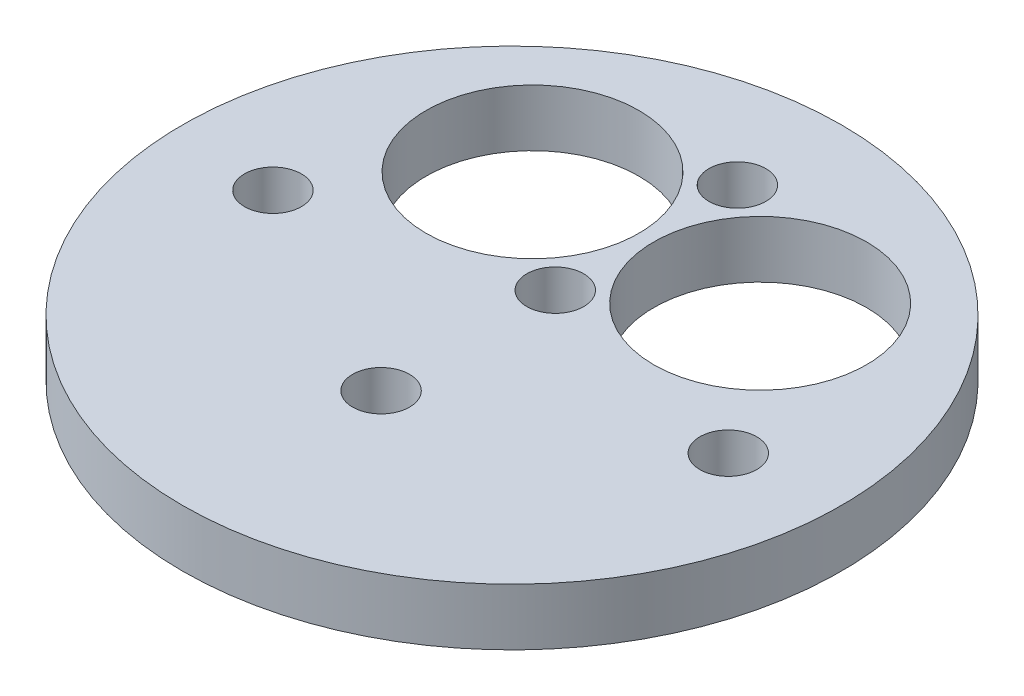
ISO-10303-21;
HEADER;
FILE_DESCRIPTION(('STEP AP214'),'2;1');
FILE_NAME('part.step','',(''),(''),'','','');
FILE_SCHEMA(('AUTOMOTIVE_DESIGN { 1 0 10303 214 1 1 1 1 }'));
ENDSEC;
DATA;
#1=APPLICATION_CONTEXT('core data for automotive mechanical design processes');
#2=APPLICATION_PROTOCOL_DEFINITION('international standard','automotive_design',2000,#1);
#3=PRODUCT_CONTEXT('',#1,'mechanical');
#4=PRODUCT('Part','Part','',(#3));
#5=PRODUCT_RELATED_PRODUCT_CATEGORY('part','',(#4));
#6=PRODUCT_DEFINITION_FORMATION('','',#4);
#7=PRODUCT_DEFINITION_CONTEXT('part definition',#1,'design');
#8=PRODUCT_DEFINITION('design','',#6,#7);
#9=PRODUCT_DEFINITION_SHAPE('','',#8);
#10=(LENGTH_UNIT() NAMED_UNIT(*) SI_UNIT(.MILLI.,.METRE.));
#11=(NAMED_UNIT(*) PLANE_ANGLE_UNIT() SI_UNIT($,.RADIAN.));
#12=(NAMED_UNIT(*) SI_UNIT($,.STERADIAN.) SOLID_ANGLE_UNIT());
#13=UNCERTAINTY_MEASURE_WITH_UNIT(LENGTH_MEASURE(1.E-05),#10,'distance_accuracy_value','');
#14=(GEOMETRIC_REPRESENTATION_CONTEXT(3) GLOBAL_UNCERTAINTY_ASSIGNED_CONTEXT((#13)) GLOBAL_UNIT_ASSIGNED_CONTEXT((#10,
#11,#12)) REPRESENTATION_CONTEXT('',''));
#15=CARTESIAN_POINT('',(0.,0.,0.));
#16=DIRECTION('',(0.,0.,1.));
#17=DIRECTION('',(1.,0.,0.));
#18=AXIS2_PLACEMENT_3D('',#15,#16,#17);
#19=CARTESIAN_POINT('',(0.,0.,0.));
#20=DIRECTION('',(0.,-1.,0.));
#21=DIRECTION('',(0.,0.,-1.));
#22=AXIS2_PLACEMENT_3D('',#19,#20,#21);
#23=PLANE('',#22);
#24=CARTESIAN_POINT('',(-25.4,0.,1.27));
#25=DIRECTION('',(0.,1.,0.));
#26=DIRECTION('',(0.,0.,1.));
#27=AXIS2_PLACEMENT_3D('',#24,#25,#26);
#28=CIRCLE('',#27,3.175);
#29=CARTESIAN_POINT('',(-25.4,0.,4.445));
#30=VERTEX_POINT('',#29);
#31=EDGE_CURVE('E120',#30,#30,#28,.T.);
#32=ORIENTED_EDGE('',*,*,#31,.T.);
#33=EDGE_LOOP('',(#32));
#34=FACE_BOUND('',#33,.T.);
#35=CARTESIAN_POINT('',(25.4,0.,1.27));
#36=DIRECTION('',(0.,1.,0.));
#37=DIRECTION('',(0.,0.,1.));
#38=AXIS2_PLACEMENT_3D('',#35,#36,#37);
#39=CIRCLE('',#38,3.175);
#40=CARTESIAN_POINT('',(25.4,0.,4.445));
#41=VERTEX_POINT('',#40);
#42=EDGE_CURVE('E124',#41,#41,#39,.T.);
#43=ORIENTED_EDGE('',*,*,#42,.T.);
#44=EDGE_LOOP('',(#43));
#45=FACE_BOUND('',#44,.T.);
#46=CARTESIAN_POINT('',(0.,0.,-25.146));
#47=DIRECTION('',(0.,1.,0.));
#48=DIRECTION('',(0.,0.,1.));
#49=AXIS2_PLACEMENT_3D('',#46,#47,#48);
#50=CIRCLE('',#49,3.175);
#51=CARTESIAN_POINT('',(0.,0.,-21.971));
#52=VERTEX_POINT('',#51);
#53=EDGE_CURVE('E137',#52,#52,#50,.T.);
#54=ORIENTED_EDGE('',*,*,#53,.T.);
#55=EDGE_LOOP('',(#54));
#56=FACE_BOUND('',#55,.T.);
#57=CARTESIAN_POINT('',(12.7,0.,-14.986));
#58=DIRECTION('',(0.,1.,0.));
#59=DIRECTION('',(0.,0.,1.));
#60=AXIS2_PLACEMENT_3D('',#57,#58,#59);
#61=CIRCLE('',#60,11.8745);
#62=CARTESIAN_POINT('',(12.7,0.,-3.1115));
#63=VERTEX_POINT('',#62);
#64=EDGE_CURVE('E142',#63,#63,#61,.T.);
#65=ORIENTED_EDGE('',*,*,#64,.T.);
#66=EDGE_LOOP('',(#65));
#67=FACE_BOUND('',#66,.T.);
#68=CARTESIAN_POINT('',(0.,0.,-4.826));
#69=DIRECTION('',(0.,1.,0.));
#70=DIRECTION('',(0.,0.,1.));
#71=AXIS2_PLACEMENT_3D('',#68,#69,#70);
#72=CIRCLE('',#71,3.175);
#73=CARTESIAN_POINT('',(0.,0.,-1.651));
#74=VERTEX_POINT('',#73);
#75=EDGE_CURVE('E134',#74,#74,#72,.T.);
#76=ORIENTED_EDGE('',*,*,#75,.T.);
#77=EDGE_LOOP('',(#76));
#78=FACE_BOUND('',#77,.T.);
#79=CARTESIAN_POINT('',(0.,0.,14.605));
#80=DIRECTION('',(0.,1.,0.));
#81=DIRECTION('',(0.,0.,1.));
#82=AXIS2_PLACEMENT_3D('',#79,#80,#81);
#83=CIRCLE('',#82,3.175);
#84=CARTESIAN_POINT('',(0.,0.,17.78));
#85=VERTEX_POINT('',#84);
#86=EDGE_CURVE('E126',#85,#85,#83,.T.);
#87=ORIENTED_EDGE('',*,*,#86,.T.);
#88=EDGE_LOOP('',(#87));
#89=FACE_BOUND('',#88,.T.);
#90=CARTESIAN_POINT('',(-12.7,0.,-14.986));
#91=DIRECTION('',(0.,1.,0.));
#92=DIRECTION('',(0.,0.,1.));
#93=AXIS2_PLACEMENT_3D('',#90,#91,#92);
#94=CIRCLE('',#93,11.8745);
#95=CARTESIAN_POINT('',(-12.7,0.,-3.1115));
#96=VERTEX_POINT('',#95);
#97=EDGE_CURVE('E54',#96,#96,#94,.T.);
#98=ORIENTED_EDGE('',*,*,#97,.T.);
#99=EDGE_LOOP('',(#98));
#100=FACE_BOUND('',#99,.T.);
#101=CARTESIAN_POINT('',(0.,0.,0.));
#102=DIRECTION('',(0.,-1.,0.));
#103=DIRECTION('',(0.,0.,-1.));
#104=AXIS2_PLACEMENT_3D('',#101,#102,#103);
#105=CIRCLE('',#104,36.7665);
#106=CARTESIAN_POINT('',(0.,0.,-36.7665));
#107=VERTEX_POINT('',#106);
#108=EDGE_CURVE('E10',#107,#107,#105,.T.);
#109=ORIENTED_EDGE('',*,*,#108,.T.);
#110=EDGE_LOOP('',(#109));
#111=FACE_BOUND('',#110,.T.);
#112=ADVANCED_FACE('F35',(#34,#45,#56,#67,#78,#89,#100,#111),#23,.T.);
#113=CARTESIAN_POINT('',(0.,0.,0.));
#114=DIRECTION('',(0.,-1.,0.));
#115=DIRECTION('',(0.,0.,-1.));
#116=AXIS2_PLACEMENT_3D('',#113,#114,#115);
#117=CYLINDRICAL_SURFACE('',#116,36.7665);
#118=CARTESIAN_POINT('',(0.,6.35,0.));
#119=DIRECTION('',(0.,-1.,0.));
#120=DIRECTION('',(0.,0.,-1.));
#121=AXIS2_PLACEMENT_3D('',#118,#119,#120);
#122=CIRCLE('',#121,36.7665);
#123=CARTESIAN_POINT('',(0.,6.35,-36.7665));
#124=VERTEX_POINT('',#123);
#125=EDGE_CURVE('E42',#124,#124,#122,.T.);
#126=ORIENTED_EDGE('',*,*,#125,.T.);
#127=EDGE_LOOP('',(#126));
#128=FACE_BOUND('',#127,.T.);
#129=ORIENTED_EDGE('',*,*,#108,.F.);
#130=EDGE_LOOP('',(#129));
#131=FACE_BOUND('',#130,.T.);
#132=ADVANCED_FACE('F73',(#128,#131),#117,.T.);
#133=CARTESIAN_POINT('',(36.7665,6.35,0.));
#134=DIRECTION('',(0.,1.,0.));
#135=DIRECTION('',(0.,0.,1.));
#136=AXIS2_PLACEMENT_3D('',#133,#134,#135);
#137=PLANE('',#136);
#138=CARTESIAN_POINT('',(-25.4,6.35,1.27));
#139=DIRECTION('',(0.,1.,0.));
#140=DIRECTION('',(0.,0.,1.));
#141=AXIS2_PLACEMENT_3D('',#138,#139,#140);
#142=CIRCLE('',#141,3.175);
#143=CARTESIAN_POINT('',(-25.4,6.35,4.445));
#144=VERTEX_POINT('',#143);
#145=EDGE_CURVE('E123',#144,#144,#142,.T.);
#146=ORIENTED_EDGE('',*,*,#145,.F.);
#147=EDGE_LOOP('',(#146));
#148=FACE_BOUND('',#147,.T.);
#149=CARTESIAN_POINT('',(25.4,6.35,1.27));
#150=DIRECTION('',(0.,1.,0.));
#151=DIRECTION('',(0.,0.,1.));
#152=AXIS2_PLACEMENT_3D('',#149,#150,#151);
#153=CIRCLE('',#152,3.175);
#154=CARTESIAN_POINT('',(25.4,6.35,4.445));
#155=VERTEX_POINT('',#154);
#156=EDGE_CURVE('E129',#155,#155,#153,.T.);
#157=ORIENTED_EDGE('',*,*,#156,.F.);
#158=EDGE_LOOP('',(#157));
#159=FACE_BOUND('',#158,.T.);
#160=CARTESIAN_POINT('',(0.,6.35,-25.146));
#161=DIRECTION('',(0.,1.,0.));
#162=DIRECTION('',(0.,0.,1.));
#163=AXIS2_PLACEMENT_3D('',#160,#161,#162);
#164=CIRCLE('',#163,3.175);
#165=CARTESIAN_POINT('',(0.,6.35,-21.971));
#166=VERTEX_POINT('',#165);
#167=EDGE_CURVE('E38',#166,#166,#164,.T.);
#168=ORIENTED_EDGE('',*,*,#167,.F.);
#169=EDGE_LOOP('',(#168));
#170=FACE_BOUND('',#169,.T.);
#171=CARTESIAN_POINT('',(12.7,6.35,-14.986));
#172=DIRECTION('',(0.,1.,0.));
#173=DIRECTION('',(0.,0.,1.));
#174=AXIS2_PLACEMENT_3D('',#171,#172,#173);
#175=CIRCLE('',#174,11.8745);
#176=CARTESIAN_POINT('',(12.7,6.35,-3.1115));
#177=VERTEX_POINT('',#176);
#178=EDGE_CURVE('E59',#177,#177,#175,.T.);
#179=ORIENTED_EDGE('',*,*,#178,.F.);
#180=EDGE_LOOP('',(#179));
#181=FACE_BOUND('',#180,.T.);
#182=CARTESIAN_POINT('',(0.,6.35,-4.826));
#183=DIRECTION('',(0.,1.,0.));
#184=DIRECTION('',(0.,0.,1.));
#185=AXIS2_PLACEMENT_3D('',#182,#183,#184);
#186=CIRCLE('',#185,3.175);
#187=CARTESIAN_POINT('',(0.,6.35,-1.651));
#188=VERTEX_POINT('',#187);
#189=EDGE_CURVE('E57',#188,#188,#186,.T.);
#190=ORIENTED_EDGE('',*,*,#189,.F.);
#191=EDGE_LOOP('',(#190));
#192=FACE_BOUND('',#191,.T.);
#193=CARTESIAN_POINT('',(0.,6.35,14.605));
#194=DIRECTION('',(0.,1.,0.));
#195=DIRECTION('',(0.,0.,1.));
#196=AXIS2_PLACEMENT_3D('',#193,#194,#195);
#197=CIRCLE('',#196,3.175);
#198=CARTESIAN_POINT('',(0.,6.35,17.78));
#199=VERTEX_POINT('',#198);
#200=EDGE_CURVE('E53',#199,#199,#197,.T.);
#201=ORIENTED_EDGE('',*,*,#200,.F.);
#202=EDGE_LOOP('',(#201));
#203=FACE_BOUND('',#202,.T.);
#204=CARTESIAN_POINT('',(-12.7,6.35,-14.986));
#205=DIRECTION('',(0.,1.,0.));
#206=DIRECTION('',(0.,0.,1.));
#207=AXIS2_PLACEMENT_3D('',#204,#205,#206);
#208=CIRCLE('',#207,11.8745);
#209=CARTESIAN_POINT('',(-12.7,6.35,-3.1115));
#210=VERTEX_POINT('',#209);
#211=EDGE_CURVE('E50',#210,#210,#208,.T.);
#212=ORIENTED_EDGE('',*,*,#211,.F.);
#213=EDGE_LOOP('',(#212));
#214=FACE_BOUND('',#213,.T.);
#215=ORIENTED_EDGE('',*,*,#125,.F.);
#216=EDGE_LOOP('',(#215));
#217=FACE_BOUND('',#216,.T.);
#218=ADVANCED_FACE('F69',(#148,#159,#170,#181,#192,#203,#214,#217),#137,.T.);
#219=CARTESIAN_POINT('',(-12.7,0.,-14.986));
#220=DIRECTION('',(0.,1.,0.));
#221=DIRECTION('',(0.,0.,1.));
#222=AXIS2_PLACEMENT_3D('',#219,#220,#221);
#223=CYLINDRICAL_SURFACE('',#222,11.8745);
#224=CARTESIAN_POINT('',(-12.7,6.35,-3.1115));
#225=CARTESIAN_POINT('',(-12.7,6.28385416666666,-3.1115));
#226=CARTESIAN_POINT('',(-12.7,6.21770833333333,-3.1115));
#227=CARTESIAN_POINT('',(-12.7,6.08541666666666,-3.1115));
#228=CARTESIAN_POINT('',(-12.7,6.01927083333333,-3.1115));
#229=CARTESIAN_POINT('',(-12.7,5.88697916666666,-3.1115));
#230=CARTESIAN_POINT('',(-12.7,5.82083333333333,-3.1115));
#231=CARTESIAN_POINT('',(-12.7,5.68854166666666,-3.1115));
#232=CARTESIAN_POINT('',(-12.7,5.62239583333333,-3.1115));
#233=CARTESIAN_POINT('',(-12.7,5.49010416666666,-3.1115));
#234=CARTESIAN_POINT('',(-12.7,5.42395833333333,-3.1115));
#235=CARTESIAN_POINT('',(-12.7,5.29166666666666,-3.1115));
#236=CARTESIAN_POINT('',(-12.7,5.22552083333333,-3.1115));
#237=CARTESIAN_POINT('',(-12.7,5.09322916666666,-3.1115));
#238=CARTESIAN_POINT('',(-12.7,5.02708333333333,-3.1115));
#239=CARTESIAN_POINT('',(-12.7,4.89479166666666,-3.1115));
#240=CARTESIAN_POINT('',(-12.7,4.82864583333333,-3.1115));
#241=CARTESIAN_POINT('',(-12.7,4.69635416666666,-3.1115));
#242=CARTESIAN_POINT('',(-12.7,4.63020833333333,-3.1115));
#243=CARTESIAN_POINT('',(-12.7,4.49791666666667,-3.1115));
#244=CARTESIAN_POINT('',(-12.7,4.43177083333333,-3.1115));
#245=CARTESIAN_POINT('',(-12.7,4.29947916666667,-3.1115));
#246=CARTESIAN_POINT('',(-12.7,4.23333333333333,-3.1115));
#247=CARTESIAN_POINT('',(-12.7,4.10104166666666,-3.1115));
#248=CARTESIAN_POINT('',(-12.7,4.03489583333333,-3.1115));
#249=CARTESIAN_POINT('',(-12.7,3.90260416666666,-3.1115));
#250=CARTESIAN_POINT('',(-12.7,3.83645833333333,-3.1115));
#251=CARTESIAN_POINT('',(-12.7,3.70416666666667,-3.1115));
#252=CARTESIAN_POINT('',(-12.7,3.63802083333333,-3.1115));
#253=CARTESIAN_POINT('',(-12.7,3.50572916666667,-3.1115));
#254=CARTESIAN_POINT('',(-12.7,3.43958333333333,-3.1115));
#255=CARTESIAN_POINT('',(-12.7,3.30729166666667,-3.1115));
#256=CARTESIAN_POINT('',(-12.7,3.24114583333333,-3.1115));
#257=CARTESIAN_POINT('',(-12.7,3.10885416666667,-3.1115));
#258=CARTESIAN_POINT('',(-12.7,3.04270833333333,-3.1115));
#259=CARTESIAN_POINT('',(-12.7,2.91041666666667,-3.1115));
#260=CARTESIAN_POINT('',(-12.7,2.84427083333333,-3.1115));
#261=CARTESIAN_POINT('',(-12.7,2.71197916666667,-3.1115));
#262=CARTESIAN_POINT('',(-12.7,2.64583333333333,-3.1115));
#263=CARTESIAN_POINT('',(-12.7,2.51354166666667,-3.1115));
#264=CARTESIAN_POINT('',(-12.7,2.44739583333333,-3.1115));
#265=CARTESIAN_POINT('',(-12.7,2.31510416666667,-3.1115));
#266=CARTESIAN_POINT('',(-12.7,2.24895833333333,-3.1115));
#267=CARTESIAN_POINT('',(-12.7,2.11666666666666,-3.1115));
#268=CARTESIAN_POINT('',(-12.7,2.05052083333333,-3.1115));
#269=CARTESIAN_POINT('',(-12.7,1.91822916666667,-3.1115));
#270=CARTESIAN_POINT('',(-12.7,1.85208333333333,-3.1115));
#271=CARTESIAN_POINT('',(-12.7,1.71979166666667,-3.1115));
#272=CARTESIAN_POINT('',(-12.7,1.65364583333333,-3.1115));
#273=CARTESIAN_POINT('',(-12.7,1.52135416666667,-3.1115));
#274=CARTESIAN_POINT('',(-12.7,1.45520833333333,-3.1115));
#275=CARTESIAN_POINT('',(-12.7,1.32291666666667,-3.1115));
#276=CARTESIAN_POINT('',(-12.7,1.25677083333333,-3.1115));
#277=CARTESIAN_POINT('',(-12.7,1.12447916666667,-3.1115));
#278=CARTESIAN_POINT('',(-12.7,1.05833333333333,-3.1115));
#279=CARTESIAN_POINT('',(-12.7,0.926041666666666,-3.1115));
#280=CARTESIAN_POINT('',(-12.7,0.859895833333333,-3.1115));
#281=CARTESIAN_POINT('',(-12.7,0.727604166666666,-3.1115));
#282=CARTESIAN_POINT('',(-12.7,0.661458333333333,-3.1115));
#283=CARTESIAN_POINT('',(-12.7,0.529166666666666,-3.1115));
#284=CARTESIAN_POINT('',(-12.7,0.463020833333333,-3.1115));
#285=CARTESIAN_POINT('',(-12.7,0.330729166666666,-3.1115));
#286=CARTESIAN_POINT('',(-12.7,0.264583333333333,-3.1115));
#287=CARTESIAN_POINT('',(-12.7,0.132291666666667,-3.1115));
#288=CARTESIAN_POINT('',(-12.7,0.0661458333333333,-3.1115));
#289=CARTESIAN_POINT('',(-12.7,0.,-3.1115));
#290=B_SPLINE_CURVE_WITH_KNOTS('',3,(#224,#225,#226,#227,#228,#229,#230,#231,#232,#233,#234,
#235,#236,#237,#238,#239,#240,#241,#242,#243,#244,#245,#246,#247,#248,#249,#250,#251,#252,#253,
#254,#255,#256,#257,#258,#259,#260,#261,#262,#263,#264,#265,#266,#267,#268,#269,#270,#271,#272,
#273,#274,#275,#276,#277,#278,#279,#280,#281,#282,#283,#284,#285,#286,#287,#288,#289),
.UNSPECIFIED.,.F.,.F.,(4,2,2,2,2,2,2,2,2,2,2,2,2,2,2,2,2,2,2,2,2,2,2,2,2,2,2,2,2,2,2,2,4),(0.,
0.1984375,0.396875,0.595312499999999,0.793749999999999,0.9921875,1.190625,1.3890625,1.5875,
1.7859375,1.984375,2.1828125,2.38125,2.5796875,2.778125,2.9765625,3.175,3.3734375,3.571875,
3.7703125,3.96875,4.1671875,4.365625,4.5640625,4.7625,4.9609375,5.159375,5.3578125,5.55625,
5.7546875,5.953125,6.1515625,6.35),.UNSPECIFIED.);
#291=EDGE_CURVE('BSEAM72',#210,#96,#290,.T.);
#292=ORIENTED_EDGE('',*,*,#211,.T.);
#293=ORIENTED_EDGE('',*,*,#97,.F.);
#294=ORIENTED_EDGE('',*,*,#291,.T.);
#295=ORIENTED_EDGE('',*,*,#291,.F.);
#296=EDGE_LOOP('',(#292,#294,#293,#295));
#297=FACE_BOUND('',#296,.T.);
#298=ADVANCED_FACE('F72',(#297),#223,.F.);
#299=CARTESIAN_POINT('',(0.,0.,14.605));
#300=DIRECTION('',(0.,1.,0.));
#301=DIRECTION('',(0.,0.,1.));
#302=AXIS2_PLACEMENT_3D('',#299,#300,#301);
#303=CYLINDRICAL_SURFACE('',#302,3.175);
#304=CARTESIAN_POINT('',(0.,6.35,17.78));
#305=CARTESIAN_POINT('',(0.,6.28385416666666,17.78));
#306=CARTESIAN_POINT('',(0.,6.21770833333333,17.78));
#307=CARTESIAN_POINT('',(0.,6.08541666666666,17.78));
#308=CARTESIAN_POINT('',(0.,6.01927083333333,17.78));
#309=CARTESIAN_POINT('',(0.,5.88697916666666,17.78));
#310=CARTESIAN_POINT('',(0.,5.82083333333333,17.78));
#311=CARTESIAN_POINT('',(0.,5.68854166666666,17.78));
#312=CARTESIAN_POINT('',(0.,5.62239583333333,17.78));
#313=CARTESIAN_POINT('',(0.,5.49010416666666,17.78));
#314=CARTESIAN_POINT('',(0.,5.42395833333333,17.78));
#315=CARTESIAN_POINT('',(0.,5.29166666666666,17.78));
#316=CARTESIAN_POINT('',(0.,5.22552083333333,17.78));
#317=CARTESIAN_POINT('',(0.,5.09322916666666,17.78));
#318=CARTESIAN_POINT('',(0.,5.02708333333333,17.78));
#319=CARTESIAN_POINT('',(0.,4.89479166666666,17.78));
#320=CARTESIAN_POINT('',(0.,4.82864583333333,17.78));
#321=CARTESIAN_POINT('',(0.,4.69635416666666,17.78));
#322=CARTESIAN_POINT('',(0.,4.63020833333333,17.78));
#323=CARTESIAN_POINT('',(0.,4.49791666666667,17.78));
#324=CARTESIAN_POINT('',(0.,4.43177083333333,17.78));
#325=CARTESIAN_POINT('',(0.,4.29947916666667,17.78));
#326=CARTESIAN_POINT('',(0.,4.23333333333333,17.78));
#327=CARTESIAN_POINT('',(0.,4.10104166666666,17.78));
#328=CARTESIAN_POINT('',(0.,4.03489583333333,17.78));
#329=CARTESIAN_POINT('',(0.,3.90260416666666,17.78));
#330=CARTESIAN_POINT('',(0.,3.83645833333333,17.78));
#331=CARTESIAN_POINT('',(0.,3.70416666666667,17.78));
#332=CARTESIAN_POINT('',(0.,3.63802083333333,17.78));
#333=CARTESIAN_POINT('',(0.,3.50572916666667,17.78));
#334=CARTESIAN_POINT('',(0.,3.43958333333333,17.78));
#335=CARTESIAN_POINT('',(0.,3.30729166666667,17.78));
#336=CARTESIAN_POINT('',(0.,3.24114583333333,17.78));
#337=CARTESIAN_POINT('',(0.,3.10885416666667,17.78));
#338=CARTESIAN_POINT('',(0.,3.04270833333333,17.78));
#339=CARTESIAN_POINT('',(0.,2.91041666666667,17.78));
#340=CARTESIAN_POINT('',(0.,2.84427083333333,17.78));
#341=CARTESIAN_POINT('',(0.,2.71197916666667,17.78));
#342=CARTESIAN_POINT('',(0.,2.64583333333333,17.78));
#343=CARTESIAN_POINT('',(0.,2.51354166666667,17.78));
#344=CARTESIAN_POINT('',(0.,2.44739583333333,17.78));
#345=CARTESIAN_POINT('',(0.,2.31510416666667,17.78));
#346=CARTESIAN_POINT('',(0.,2.24895833333333,17.78));
#347=CARTESIAN_POINT('',(0.,2.11666666666666,17.78));
#348=CARTESIAN_POINT('',(0.,2.05052083333333,17.78));
#349=CARTESIAN_POINT('',(0.,1.91822916666667,17.78));
#350=CARTESIAN_POINT('',(0.,1.85208333333333,17.78));
#351=CARTESIAN_POINT('',(0.,1.71979166666667,17.78));
#352=CARTESIAN_POINT('',(0.,1.65364583333333,17.78));
#353=CARTESIAN_POINT('',(0.,1.52135416666667,17.78));
#354=CARTESIAN_POINT('',(0.,1.45520833333333,17.78));
#355=CARTESIAN_POINT('',(0.,1.32291666666667,17.78));
#356=CARTESIAN_POINT('',(0.,1.25677083333333,17.78));
#357=CARTESIAN_POINT('',(0.,1.12447916666667,17.78));
#358=CARTESIAN_POINT('',(0.,1.05833333333333,17.78));
#359=CARTESIAN_POINT('',(0.,0.926041666666666,17.78));
#360=CARTESIAN_POINT('',(0.,0.859895833333333,17.78));
#361=CARTESIAN_POINT('',(0.,0.727604166666666,17.78));
#362=CARTESIAN_POINT('',(0.,0.661458333333333,17.78));
#363=CARTESIAN_POINT('',(0.,0.529166666666666,17.78));
#364=CARTESIAN_POINT('',(0.,0.463020833333333,17.78));
#365=CARTESIAN_POINT('',(0.,0.330729166666666,17.78));
#366=CARTESIAN_POINT('',(0.,0.264583333333333,17.78));
#367=CARTESIAN_POINT('',(0.,0.132291666666667,17.78));
#368=CARTESIAN_POINT('',(0.,0.0661458333333333,17.78));
#369=CARTESIAN_POINT('',(0.,0.,17.78));
#370=B_SPLINE_CURVE_WITH_KNOTS('',3,(#304,#305,#306,#307,#308,#309,#310,#311,#312,#313,#314,
#315,#316,#317,#318,#319,#320,#321,#322,#323,#324,#325,#326,#327,#328,#329,#330,#331,#332,#333,
#334,#335,#336,#337,#338,#339,#340,#341,#342,#343,#344,#345,#346,#347,#348,#349,#350,#351,#352,
#353,#354,#355,#356,#357,#358,#359,#360,#361,#362,#363,#364,#365,#366,#367,#368,#369),
.UNSPECIFIED.,.F.,.F.,(4,2,2,2,2,2,2,2,2,2,2,2,2,2,2,2,2,2,2,2,2,2,2,2,2,2,2,2,2,2,2,2,4),(0.,
0.1984375,0.396875,0.595312499999999,0.793749999999999,0.9921875,1.190625,1.3890625,1.5875,
1.7859375,1.984375,2.1828125,2.38125,2.5796875,2.778125,2.9765625,3.175,3.3734375,3.571875,
3.7703125,3.96875,4.1671875,4.365625,4.5640625,4.7625,4.9609375,5.159375,5.3578125,5.55625,
5.7546875,5.953125,6.1515625,6.35),.UNSPECIFIED.);
#371=EDGE_CURVE('BSEAM94',#199,#85,#370,.T.);
#372=ORIENTED_EDGE('',*,*,#200,.T.);
#373=ORIENTED_EDGE('',*,*,#86,.F.);
#374=ORIENTED_EDGE('',*,*,#371,.T.);
#375=ORIENTED_EDGE('',*,*,#371,.F.);
#376=EDGE_LOOP('',(#372,#374,#373,#375));
#377=FACE_BOUND('',#376,.T.);
#378=ADVANCED_FACE('F94',(#377),#303,.F.);
#379=CARTESIAN_POINT('',(0.,0.,-4.826));
#380=DIRECTION('',(0.,1.,0.));
#381=DIRECTION('',(0.,0.,1.));
#382=AXIS2_PLACEMENT_3D('',#379,#380,#381);
#383=CYLINDRICAL_SURFACE('',#382,3.175);
#384=CARTESIAN_POINT('',(0.,6.35,-1.651));
#385=CARTESIAN_POINT('',(0.,6.28385416666666,-1.651));
#386=CARTESIAN_POINT('',(0.,6.21770833333333,-1.651));
#387=CARTESIAN_POINT('',(0.,6.08541666666666,-1.651));
#388=CARTESIAN_POINT('',(0.,6.01927083333333,-1.651));
#389=CARTESIAN_POINT('',(0.,5.88697916666666,-1.651));
#390=CARTESIAN_POINT('',(0.,5.82083333333333,-1.651));
#391=CARTESIAN_POINT('',(0.,5.68854166666666,-1.651));
#392=CARTESIAN_POINT('',(0.,5.62239583333333,-1.651));
#393=CARTESIAN_POINT('',(0.,5.49010416666666,-1.651));
#394=CARTESIAN_POINT('',(0.,5.42395833333333,-1.651));
#395=CARTESIAN_POINT('',(0.,5.29166666666666,-1.651));
#396=CARTESIAN_POINT('',(0.,5.22552083333333,-1.651));
#397=CARTESIAN_POINT('',(0.,5.09322916666666,-1.651));
#398=CARTESIAN_POINT('',(0.,5.02708333333333,-1.651));
#399=CARTESIAN_POINT('',(0.,4.89479166666666,-1.651));
#400=CARTESIAN_POINT('',(0.,4.82864583333333,-1.651));
#401=CARTESIAN_POINT('',(0.,4.69635416666666,-1.651));
#402=CARTESIAN_POINT('',(0.,4.63020833333333,-1.651));
#403=CARTESIAN_POINT('',(0.,4.49791666666667,-1.651));
#404=CARTESIAN_POINT('',(0.,4.43177083333333,-1.651));
#405=CARTESIAN_POINT('',(0.,4.29947916666667,-1.651));
#406=CARTESIAN_POINT('',(0.,4.23333333333333,-1.651));
#407=CARTESIAN_POINT('',(0.,4.10104166666666,-1.651));
#408=CARTESIAN_POINT('',(0.,4.03489583333333,-1.651));
#409=CARTESIAN_POINT('',(0.,3.90260416666666,-1.651));
#410=CARTESIAN_POINT('',(0.,3.83645833333333,-1.651));
#411=CARTESIAN_POINT('',(0.,3.70416666666667,-1.651));
#412=CARTESIAN_POINT('',(0.,3.63802083333333,-1.651));
#413=CARTESIAN_POINT('',(0.,3.50572916666667,-1.651));
#414=CARTESIAN_POINT('',(0.,3.43958333333333,-1.651));
#415=CARTESIAN_POINT('',(0.,3.30729166666667,-1.651));
#416=CARTESIAN_POINT('',(0.,3.24114583333333,-1.651));
#417=CARTESIAN_POINT('',(0.,3.10885416666667,-1.651));
#418=CARTESIAN_POINT('',(0.,3.04270833333333,-1.651));
#419=CARTESIAN_POINT('',(0.,2.91041666666667,-1.651));
#420=CARTESIAN_POINT('',(0.,2.84427083333333,-1.651));
#421=CARTESIAN_POINT('',(0.,2.71197916666667,-1.651));
#422=CARTESIAN_POINT('',(0.,2.64583333333333,-1.651));
#423=CARTESIAN_POINT('',(0.,2.51354166666667,-1.651));
#424=CARTESIAN_POINT('',(0.,2.44739583333333,-1.651));
#425=CARTESIAN_POINT('',(0.,2.31510416666667,-1.651));
#426=CARTESIAN_POINT('',(0.,2.24895833333333,-1.651));
#427=CARTESIAN_POINT('',(0.,2.11666666666666,-1.651));
#428=CARTESIAN_POINT('',(0.,2.05052083333333,-1.651));
#429=CARTESIAN_POINT('',(0.,1.91822916666667,-1.651));
#430=CARTESIAN_POINT('',(0.,1.85208333333333,-1.651));
#431=CARTESIAN_POINT('',(0.,1.71979166666667,-1.651));
#432=CARTESIAN_POINT('',(0.,1.65364583333333,-1.651));
#433=CARTESIAN_POINT('',(0.,1.52135416666667,-1.651));
#434=CARTESIAN_POINT('',(0.,1.45520833333333,-1.651));
#435=CARTESIAN_POINT('',(0.,1.32291666666667,-1.651));
#436=CARTESIAN_POINT('',(0.,1.25677083333333,-1.651));
#437=CARTESIAN_POINT('',(0.,1.12447916666667,-1.651));
#438=CARTESIAN_POINT('',(0.,1.05833333333333,-1.651));
#439=CARTESIAN_POINT('',(0.,0.926041666666666,-1.651));
#440=CARTESIAN_POINT('',(0.,0.859895833333333,-1.651));
#441=CARTESIAN_POINT('',(0.,0.727604166666666,-1.651));
#442=CARTESIAN_POINT('',(0.,0.661458333333333,-1.651));
#443=CARTESIAN_POINT('',(0.,0.529166666666666,-1.651));
#444=CARTESIAN_POINT('',(0.,0.463020833333333,-1.651));
#445=CARTESIAN_POINT('',(0.,0.330729166666666,-1.651));
#446=CARTESIAN_POINT('',(0.,0.264583333333333,-1.651));
#447=CARTESIAN_POINT('',(0.,0.132291666666667,-1.651));
#448=CARTESIAN_POINT('',(0.,0.0661458333333333,-1.651));
#449=CARTESIAN_POINT('',(0.,0.,-1.651));
#450=B_SPLINE_CURVE_WITH_KNOTS('',3,(#384,#385,#386,#387,#388,#389,#390,#391,#392,#393,#394,
#395,#396,#397,#398,#399,#400,#401,#402,#403,#404,#405,#406,#407,#408,#409,#410,#411,#412,#413,
#414,#415,#416,#417,#418,#419,#420,#421,#422,#423,#424,#425,#426,#427,#428,#429,#430,#431,#432,
#433,#434,#435,#436,#437,#438,#439,#440,#441,#442,#443,#444,#445,#446,#447,#448,#449),
.UNSPECIFIED.,.F.,.F.,(4,2,2,2,2,2,2,2,2,2,2,2,2,2,2,2,2,2,2,2,2,2,2,2,2,2,2,2,2,2,2,2,4),(0.,
0.1984375,0.396875,0.595312499999999,0.793749999999999,0.9921875,1.190625,1.3890625,1.5875,
1.7859375,1.984375,2.1828125,2.38125,2.5796875,2.778125,2.9765625,3.175,3.3734375,3.571875,
3.7703125,3.96875,4.1671875,4.365625,4.5640625,4.7625,4.9609375,5.159375,5.3578125,5.55625,
5.7546875,5.953125,6.1515625,6.35),.UNSPECIFIED.);
#451=EDGE_CURVE('BSEAM99',#188,#74,#450,.T.);
#452=ORIENTED_EDGE('',*,*,#189,.T.);
#453=ORIENTED_EDGE('',*,*,#75,.F.);
#454=ORIENTED_EDGE('',*,*,#451,.T.);
#455=ORIENTED_EDGE('',*,*,#451,.F.);
#456=EDGE_LOOP('',(#452,#454,#453,#455));
#457=FACE_BOUND('',#456,.T.);
#458=ADVANCED_FACE('F99',(#457),#383,.F.);
#459=CARTESIAN_POINT('',(12.7,0.,-14.986));
#460=DIRECTION('',(0.,1.,0.));
#461=DIRECTION('',(0.,0.,1.));
#462=AXIS2_PLACEMENT_3D('',#459,#460,#461);
#463=CYLINDRICAL_SURFACE('',#462,11.8745);
#464=CARTESIAN_POINT('',(12.7,6.35,-3.1115));
#465=CARTESIAN_POINT('',(12.7,6.28385416666666,-3.1115));
#466=CARTESIAN_POINT('',(12.7,6.21770833333333,-3.1115));
#467=CARTESIAN_POINT('',(12.7,6.08541666666666,-3.1115));
#468=CARTESIAN_POINT('',(12.7,6.01927083333333,-3.1115));
#469=CARTESIAN_POINT('',(12.7,5.88697916666666,-3.1115));
#470=CARTESIAN_POINT('',(12.7,5.82083333333333,-3.1115));
#471=CARTESIAN_POINT('',(12.7,5.68854166666666,-3.1115));
#472=CARTESIAN_POINT('',(12.7,5.62239583333333,-3.1115));
#473=CARTESIAN_POINT('',(12.7,5.49010416666666,-3.1115));
#474=CARTESIAN_POINT('',(12.7,5.42395833333333,-3.1115));
#475=CARTESIAN_POINT('',(12.7,5.29166666666666,-3.1115));
#476=CARTESIAN_POINT('',(12.7,5.22552083333333,-3.1115));
#477=CARTESIAN_POINT('',(12.7,5.09322916666666,-3.1115));
#478=CARTESIAN_POINT('',(12.7,5.02708333333333,-3.1115));
#479=CARTESIAN_POINT('',(12.7,4.89479166666666,-3.1115));
#480=CARTESIAN_POINT('',(12.7,4.82864583333333,-3.1115));
#481=CARTESIAN_POINT('',(12.7,4.69635416666666,-3.1115));
#482=CARTESIAN_POINT('',(12.7,4.63020833333333,-3.1115));
#483=CARTESIAN_POINT('',(12.7,4.49791666666667,-3.1115));
#484=CARTESIAN_POINT('',(12.7,4.43177083333333,-3.1115));
#485=CARTESIAN_POINT('',(12.7,4.29947916666667,-3.1115));
#486=CARTESIAN_POINT('',(12.7,4.23333333333333,-3.1115));
#487=CARTESIAN_POINT('',(12.7,4.10104166666666,-3.1115));
#488=CARTESIAN_POINT('',(12.7,4.03489583333333,-3.1115));
#489=CARTESIAN_POINT('',(12.7,3.90260416666666,-3.1115));
#490=CARTESIAN_POINT('',(12.7,3.83645833333333,-3.1115));
#491=CARTESIAN_POINT('',(12.7,3.70416666666667,-3.1115));
#492=CARTESIAN_POINT('',(12.7,3.63802083333333,-3.1115));
#493=CARTESIAN_POINT('',(12.7,3.50572916666667,-3.1115));
#494=CARTESIAN_POINT('',(12.7,3.43958333333333,-3.1115));
#495=CARTESIAN_POINT('',(12.7,3.30729166666667,-3.1115));
#496=CARTESIAN_POINT('',(12.7,3.24114583333333,-3.1115));
#497=CARTESIAN_POINT('',(12.7,3.10885416666667,-3.1115));
#498=CARTESIAN_POINT('',(12.7,3.04270833333333,-3.1115));
#499=CARTESIAN_POINT('',(12.7,2.91041666666667,-3.1115));
#500=CARTESIAN_POINT('',(12.7,2.84427083333333,-3.1115));
#501=CARTESIAN_POINT('',(12.7,2.71197916666667,-3.1115));
#502=CARTESIAN_POINT('',(12.7,2.64583333333333,-3.1115));
#503=CARTESIAN_POINT('',(12.7,2.51354166666667,-3.1115));
#504=CARTESIAN_POINT('',(12.7,2.44739583333333,-3.1115));
#505=CARTESIAN_POINT('',(12.7,2.31510416666667,-3.1115));
#506=CARTESIAN_POINT('',(12.7,2.24895833333333,-3.1115));
#507=CARTESIAN_POINT('',(12.7,2.11666666666666,-3.1115));
#508=CARTESIAN_POINT('',(12.7,2.05052083333333,-3.1115));
#509=CARTESIAN_POINT('',(12.7,1.91822916666667,-3.1115));
#510=CARTESIAN_POINT('',(12.7,1.85208333333333,-3.1115));
#511=CARTESIAN_POINT('',(12.7,1.71979166666667,-3.1115));
#512=CARTESIAN_POINT('',(12.7,1.65364583333333,-3.1115));
#513=CARTESIAN_POINT('',(12.7,1.52135416666667,-3.1115));
#514=CARTESIAN_POINT('',(12.7,1.45520833333333,-3.1115));
#515=CARTESIAN_POINT('',(12.7,1.32291666666667,-3.1115));
#516=CARTESIAN_POINT('',(12.7,1.25677083333333,-3.1115));
#517=CARTESIAN_POINT('',(12.7,1.12447916666667,-3.1115));
#518=CARTESIAN_POINT('',(12.7,1.05833333333333,-3.1115));
#519=CARTESIAN_POINT('',(12.7,0.926041666666666,-3.1115));
#520=CARTESIAN_POINT('',(12.7,0.859895833333333,-3.1115));
#521=CARTESIAN_POINT('',(12.7,0.727604166666666,-3.1115));
#522=CARTESIAN_POINT('',(12.7,0.661458333333333,-3.1115));
#523=CARTESIAN_POINT('',(12.7,0.529166666666666,-3.1115));
#524=CARTESIAN_POINT('',(12.7,0.463020833333333,-3.1115));
#525=CARTESIAN_POINT('',(12.7,0.330729166666666,-3.1115));
#526=CARTESIAN_POINT('',(12.7,0.264583333333333,-3.1115));
#527=CARTESIAN_POINT('',(12.7,0.132291666666667,-3.1115));
#528=CARTESIAN_POINT('',(12.7,0.0661458333333333,-3.1115));
#529=CARTESIAN_POINT('',(12.7,0.,-3.1115));
#530=B_SPLINE_CURVE_WITH_KNOTS('',3,(#464,#465,#466,#467,#468,#469,#470,#471,#472,#473,#474,
#475,#476,#477,#478,#479,#480,#481,#482,#483,#484,#485,#486,#487,#488,#489,#490,#491,#492,#493,
#494,#495,#496,#497,#498,#499,#500,#501,#502,#503,#504,#505,#506,#507,#508,#509,#510,#511,#512,
#513,#514,#515,#516,#517,#518,#519,#520,#521,#522,#523,#524,#525,#526,#527,#528,#529),
.UNSPECIFIED.,.F.,.F.,(4,2,2,2,2,2,2,2,2,2,2,2,2,2,2,2,2,2,2,2,2,2,2,2,2,2,2,2,2,2,2,2,4),(0.,
0.1984375,0.396875,0.595312499999999,0.793749999999999,0.9921875,1.190625,1.3890625,1.5875,
1.7859375,1.984375,2.1828125,2.38125,2.5796875,2.778125,2.9765625,3.175,3.3734375,3.571875,
3.7703125,3.96875,4.1671875,4.365625,4.5640625,4.7625,4.9609375,5.159375,5.3578125,5.55625,
5.7546875,5.953125,6.1515625,6.35),.UNSPECIFIED.);
#531=EDGE_CURVE('BSEAM96',#177,#63,#530,.T.);
#532=ORIENTED_EDGE('',*,*,#178,.T.);
#533=ORIENTED_EDGE('',*,*,#64,.F.);
#534=ORIENTED_EDGE('',*,*,#531,.T.);
#535=ORIENTED_EDGE('',*,*,#531,.F.);
#536=EDGE_LOOP('',(#532,#534,#533,#535));
#537=FACE_BOUND('',#536,.T.);
#538=ADVANCED_FACE('F96',(#537),#463,.F.);
#539=CARTESIAN_POINT('',(0.,0.,-25.146));
#540=DIRECTION('',(0.,1.,0.));
#541=DIRECTION('',(0.,0.,1.));
#542=AXIS2_PLACEMENT_3D('',#539,#540,#541);
#543=CYLINDRICAL_SURFACE('',#542,3.175);
#544=CARTESIAN_POINT('',(0.,6.35,-21.971));
#545=CARTESIAN_POINT('',(0.,6.28385416666666,-21.971));
#546=CARTESIAN_POINT('',(0.,6.21770833333333,-21.971));
#547=CARTESIAN_POINT('',(0.,6.08541666666666,-21.971));
#548=CARTESIAN_POINT('',(0.,6.01927083333333,-21.971));
#549=CARTESIAN_POINT('',(0.,5.88697916666666,-21.971));
#550=CARTESIAN_POINT('',(0.,5.82083333333333,-21.971));
#551=CARTESIAN_POINT('',(0.,5.68854166666666,-21.971));
#552=CARTESIAN_POINT('',(0.,5.62239583333333,-21.971));
#553=CARTESIAN_POINT('',(0.,5.49010416666666,-21.971));
#554=CARTESIAN_POINT('',(0.,5.42395833333333,-21.971));
#555=CARTESIAN_POINT('',(0.,5.29166666666666,-21.971));
#556=CARTESIAN_POINT('',(0.,5.22552083333333,-21.971));
#557=CARTESIAN_POINT('',(0.,5.09322916666666,-21.971));
#558=CARTESIAN_POINT('',(0.,5.02708333333333,-21.971));
#559=CARTESIAN_POINT('',(0.,4.89479166666666,-21.971));
#560=CARTESIAN_POINT('',(0.,4.82864583333333,-21.971));
#561=CARTESIAN_POINT('',(0.,4.69635416666666,-21.971));
#562=CARTESIAN_POINT('',(0.,4.63020833333333,-21.971));
#563=CARTESIAN_POINT('',(0.,4.49791666666667,-21.971));
#564=CARTESIAN_POINT('',(0.,4.43177083333333,-21.971));
#565=CARTESIAN_POINT('',(0.,4.29947916666667,-21.971));
#566=CARTESIAN_POINT('',(0.,4.23333333333333,-21.971));
#567=CARTESIAN_POINT('',(0.,4.10104166666666,-21.971));
#568=CARTESIAN_POINT('',(0.,4.03489583333333,-21.971));
#569=CARTESIAN_POINT('',(0.,3.90260416666666,-21.971));
#570=CARTESIAN_POINT('',(0.,3.83645833333333,-21.971));
#571=CARTESIAN_POINT('',(0.,3.70416666666667,-21.971));
#572=CARTESIAN_POINT('',(0.,3.63802083333333,-21.971));
#573=CARTESIAN_POINT('',(0.,3.50572916666667,-21.971));
#574=CARTESIAN_POINT('',(0.,3.43958333333333,-21.971));
#575=CARTESIAN_POINT('',(0.,3.30729166666667,-21.971));
#576=CARTESIAN_POINT('',(0.,3.24114583333333,-21.971));
#577=CARTESIAN_POINT('',(0.,3.10885416666667,-21.971));
#578=CARTESIAN_POINT('',(0.,3.04270833333333,-21.971));
#579=CARTESIAN_POINT('',(0.,2.91041666666667,-21.971));
#580=CARTESIAN_POINT('',(0.,2.84427083333333,-21.971));
#581=CARTESIAN_POINT('',(0.,2.71197916666667,-21.971));
#582=CARTESIAN_POINT('',(0.,2.64583333333333,-21.971));
#583=CARTESIAN_POINT('',(0.,2.51354166666667,-21.971));
#584=CARTESIAN_POINT('',(0.,2.44739583333333,-21.971));
#585=CARTESIAN_POINT('',(0.,2.31510416666667,-21.971));
#586=CARTESIAN_POINT('',(0.,2.24895833333333,-21.971));
#587=CARTESIAN_POINT('',(0.,2.11666666666666,-21.971));
#588=CARTESIAN_POINT('',(0.,2.05052083333333,-21.971));
#589=CARTESIAN_POINT('',(0.,1.91822916666667,-21.971));
#590=CARTESIAN_POINT('',(0.,1.85208333333333,-21.971));
#591=CARTESIAN_POINT('',(0.,1.71979166666667,-21.971));
#592=CARTESIAN_POINT('',(0.,1.65364583333333,-21.971));
#593=CARTESIAN_POINT('',(0.,1.52135416666667,-21.971));
#594=CARTESIAN_POINT('',(0.,1.45520833333333,-21.971));
#595=CARTESIAN_POINT('',(0.,1.32291666666667,-21.971));
#596=CARTESIAN_POINT('',(0.,1.25677083333333,-21.971));
#597=CARTESIAN_POINT('',(0.,1.12447916666667,-21.971));
#598=CARTESIAN_POINT('',(0.,1.05833333333333,-21.971));
#599=CARTESIAN_POINT('',(0.,0.926041666666666,-21.971));
#600=CARTESIAN_POINT('',(0.,0.859895833333333,-21.971));
#601=CARTESIAN_POINT('',(0.,0.727604166666666,-21.971));
#602=CARTESIAN_POINT('',(0.,0.661458333333333,-21.971));
#603=CARTESIAN_POINT('',(0.,0.529166666666666,-21.971));
#604=CARTESIAN_POINT('',(0.,0.463020833333333,-21.971));
#605=CARTESIAN_POINT('',(0.,0.330729166666666,-21.971));
#606=CARTESIAN_POINT('',(0.,0.264583333333333,-21.971));
#607=CARTESIAN_POINT('',(0.,0.132291666666667,-21.971));
#608=CARTESIAN_POINT('',(0.,0.0661458333333333,-21.971));
#609=CARTESIAN_POINT('',(0.,0.,-21.971));
#610=B_SPLINE_CURVE_WITH_KNOTS('',3,(#544,#545,#546,#547,#548,#549,#550,#551,#552,#553,#554,
#555,#556,#557,#558,#559,#560,#561,#562,#563,#564,#565,#566,#567,#568,#569,#570,#571,#572,#573,
#574,#575,#576,#577,#578,#579,#580,#581,#582,#583,#584,#585,#586,#587,#588,#589,#590,#591,#592,
#593,#594,#595,#596,#597,#598,#599,#600,#601,#602,#603,#604,#605,#606,#607,#608,#609),
.UNSPECIFIED.,.F.,.F.,(4,2,2,2,2,2,2,2,2,2,2,2,2,2,2,2,2,2,2,2,2,2,2,2,2,2,2,2,2,2,2,2,4),(0.,
0.1984375,0.396875,0.595312499999999,0.793749999999999,0.9921875,1.190625,1.3890625,1.5875,
1.7859375,1.984375,2.1828125,2.38125,2.5796875,2.778125,2.9765625,3.175,3.3734375,3.571875,
3.7703125,3.96875,4.1671875,4.365625,4.5640625,4.7625,4.9609375,5.159375,5.3578125,5.55625,
5.7546875,5.953125,6.1515625,6.35),.UNSPECIFIED.);
#611=EDGE_CURVE('BSEAM66',#166,#52,#610,.T.);
#612=ORIENTED_EDGE('',*,*,#167,.T.);
#613=ORIENTED_EDGE('',*,*,#53,.F.);
#614=ORIENTED_EDGE('',*,*,#611,.T.);
#615=ORIENTED_EDGE('',*,*,#611,.F.);
#616=EDGE_LOOP('',(#612,#614,#613,#615));
#617=FACE_BOUND('',#616,.T.);
#618=ADVANCED_FACE('F66',(#617),#543,.F.);
#619=CARTESIAN_POINT('',(25.4,0.,1.27));
#620=DIRECTION('',(0.,1.,0.));
#621=DIRECTION('',(0.,0.,1.));
#622=AXIS2_PLACEMENT_3D('',#619,#620,#621);
#623=CYLINDRICAL_SURFACE('',#622,3.175);
#624=CARTESIAN_POINT('',(25.4,0.,4.445));
#625=CARTESIAN_POINT('',(25.4,0.0661458333333332,4.445));
#626=CARTESIAN_POINT('',(25.4,0.132291666666667,4.445));
#627=CARTESIAN_POINT('',(25.4,0.264583333333333,4.445));
#628=CARTESIAN_POINT('',(25.4,0.330729166666667,4.445));
#629=CARTESIAN_POINT('',(25.4,0.463020833333333,4.445));
#630=CARTESIAN_POINT('',(25.4,0.529166666666666,4.445));
#631=CARTESIAN_POINT('',(25.4,0.661458333333333,4.445));
#632=CARTESIAN_POINT('',(25.4,0.727604166666666,4.445));
#633=CARTESIAN_POINT('',(25.4,0.859895833333333,4.445));
#634=CARTESIAN_POINT('',(25.4,0.926041666666666,4.445));
#635=CARTESIAN_POINT('',(25.4,1.05833333333333,4.445));
#636=CARTESIAN_POINT('',(25.4,1.12447916666667,4.445));
#637=CARTESIAN_POINT('',(25.4,1.25677083333333,4.445));
#638=CARTESIAN_POINT('',(25.4,1.32291666666667,4.445));
#639=CARTESIAN_POINT('',(25.4,1.45520833333333,4.445));
#640=CARTESIAN_POINT('',(25.4,1.52135416666667,4.445));
#641=CARTESIAN_POINT('',(25.4,1.65364583333333,4.445));
#642=CARTESIAN_POINT('',(25.4,1.71979166666667,4.445));
#643=CARTESIAN_POINT('',(25.4,1.85208333333333,4.445));
#644=CARTESIAN_POINT('',(25.4,1.91822916666667,4.445));
#645=CARTESIAN_POINT('',(25.4,2.05052083333333,4.445));
#646=CARTESIAN_POINT('',(25.4,2.11666666666667,4.445));
#647=CARTESIAN_POINT('',(25.4,2.24895833333333,4.445));
#648=CARTESIAN_POINT('',(25.4,2.31510416666667,4.445));
#649=CARTESIAN_POINT('',(25.4,2.44739583333333,4.445));
#650=CARTESIAN_POINT('',(25.4,2.51354166666667,4.445));
#651=CARTESIAN_POINT('',(25.4,2.64583333333333,4.445));
#652=CARTESIAN_POINT('',(25.4,2.71197916666667,4.445));
#653=CARTESIAN_POINT('',(25.4,2.84427083333333,4.445));
#654=CARTESIAN_POINT('',(25.4,2.91041666666667,4.445));
#655=CARTESIAN_POINT('',(25.4,3.04270833333333,4.445));
#656=CARTESIAN_POINT('',(25.4,3.10885416666667,4.445));
#657=CARTESIAN_POINT('',(25.4,3.24114583333333,4.445));
#658=CARTESIAN_POINT('',(25.4,3.30729166666667,4.445));
#659=CARTESIAN_POINT('',(25.4,3.43958333333333,4.445));
#660=CARTESIAN_POINT('',(25.4,3.50572916666667,4.445));
#661=CARTESIAN_POINT('',(25.4,3.63802083333333,4.445));
#662=CARTESIAN_POINT('',(25.4,3.70416666666667,4.445));
#663=CARTESIAN_POINT('',(25.4,3.83645833333333,4.445));
#664=CARTESIAN_POINT('',(25.4,3.90260416666666,4.445));
#665=CARTESIAN_POINT('',(25.4,4.03489583333333,4.445));
#666=CARTESIAN_POINT('',(25.4,4.10104166666666,4.445));
#667=CARTESIAN_POINT('',(25.4,4.23333333333333,4.445));
#668=CARTESIAN_POINT('',(25.4,4.29947916666667,4.445));
#669=CARTESIAN_POINT('',(25.4,4.43177083333333,4.445));
#670=CARTESIAN_POINT('',(25.4,4.49791666666667,4.445));
#671=CARTESIAN_POINT('',(25.4,4.63020833333333,4.445));
#672=CARTESIAN_POINT('',(25.4,4.69635416666666,4.445));
#673=CARTESIAN_POINT('',(25.4,4.82864583333333,4.445));
#674=CARTESIAN_POINT('',(25.4,4.89479166666666,4.445));
#675=CARTESIAN_POINT('',(25.4,5.02708333333333,4.445));
#676=CARTESIAN_POINT('',(25.4,5.09322916666666,4.445));
#677=CARTESIAN_POINT('',(25.4,5.22552083333333,4.445));
#678=CARTESIAN_POINT('',(25.4,5.29166666666666,4.445));
#679=CARTESIAN_POINT('',(25.4,5.42395833333333,4.445));
#680=CARTESIAN_POINT('',(25.4,5.49010416666666,4.445));
#681=CARTESIAN_POINT('',(25.4,5.62239583333333,4.445));
#682=CARTESIAN_POINT('',(25.4,5.68854166666666,4.445));
#683=CARTESIAN_POINT('',(25.4,5.82083333333333,4.445));
#684=CARTESIAN_POINT('',(25.4,5.88697916666666,4.445));
#685=CARTESIAN_POINT('',(25.4,6.01927083333333,4.445));
#686=CARTESIAN_POINT('',(25.4,6.08541666666666,4.445));
#687=CARTESIAN_POINT('',(25.4,6.21770833333333,4.445));
#688=CARTESIAN_POINT('',(25.4,6.28385416666666,4.445));
#689=CARTESIAN_POINT('',(25.4,6.35,4.445));
#690=B_SPLINE_CURVE_WITH_KNOTS('',3,(#624,#625,#626,#627,#628,#629,#630,#631,#632,#633,#634,
#635,#636,#637,#638,#639,#640,#641,#642,#643,#644,#645,#646,#647,#648,#649,#650,#651,#652,#653,
#654,#655,#656,#657,#658,#659,#660,#661,#662,#663,#664,#665,#666,#667,#668,#669,#670,#671,#672,
#673,#674,#675,#676,#677,#678,#679,#680,#681,#682,#683,#684,#685,#686,#687,#688,#689),
.UNSPECIFIED.,.F.,.F.,(4,2,2,2,2,2,2,2,2,2,2,2,2,2,2,2,2,2,2,2,2,2,2,2,2,2,2,2,2,2,2,2,4),(0.,
0.1984375,0.396875,0.5953125,0.79375,0.992187499999999,1.190625,1.3890625,1.5875,1.7859375,
1.984375,2.1828125,2.38125,2.5796875,2.778125,2.9765625,3.175,3.3734375,3.571875,3.7703125,
3.96875,4.1671875,4.365625,4.5640625,4.7625,4.9609375,5.159375,5.3578125,5.55625,5.7546875,
5.953125,6.1515625,6.35),.UNSPECIFIED.);
#691=EDGE_CURVE('BSEAM102',#41,#155,#690,.T.);
#692=ORIENTED_EDGE('',*,*,#42,.F.);
#693=ORIENTED_EDGE('',*,*,#156,.T.);
#694=ORIENTED_EDGE('',*,*,#691,.T.);
#695=ORIENTED_EDGE('',*,*,#691,.F.);
#696=EDGE_LOOP('',(#692,#694,#693,#695));
#697=FACE_BOUND('',#696,.T.);
#698=ADVANCED_FACE('F102',(#697),#623,.F.);
#699=CARTESIAN_POINT('',(-25.4,0.,1.27));
#700=DIRECTION('',(0.,1.,0.));
#701=DIRECTION('',(0.,0.,1.));
#702=AXIS2_PLACEMENT_3D('',#699,#700,#701);
#703=CYLINDRICAL_SURFACE('',#702,3.175);
#704=CARTESIAN_POINT('',(-25.4,0.,4.445));
#705=CARTESIAN_POINT('',(-25.4,0.0661458333333332,4.445));
#706=CARTESIAN_POINT('',(-25.4,0.132291666666667,4.445));
#707=CARTESIAN_POINT('',(-25.4,0.264583333333333,4.445));
#708=CARTESIAN_POINT('',(-25.4,0.330729166666667,4.445));
#709=CARTESIAN_POINT('',(-25.4,0.463020833333333,4.445));
#710=CARTESIAN_POINT('',(-25.4,0.529166666666666,4.445));
#711=CARTESIAN_POINT('',(-25.4,0.661458333333333,4.445));
#712=CARTESIAN_POINT('',(-25.4,0.727604166666666,4.445));
#713=CARTESIAN_POINT('',(-25.4,0.859895833333333,4.445));
#714=CARTESIAN_POINT('',(-25.4,0.926041666666666,4.445));
#715=CARTESIAN_POINT('',(-25.4,1.05833333333333,4.445));
#716=CARTESIAN_POINT('',(-25.4,1.12447916666667,4.445));
#717=CARTESIAN_POINT('',(-25.4,1.25677083333333,4.445));
#718=CARTESIAN_POINT('',(-25.4,1.32291666666667,4.445));
#719=CARTESIAN_POINT('',(-25.4,1.45520833333333,4.445));
#720=CARTESIAN_POINT('',(-25.4,1.52135416666667,4.445));
#721=CARTESIAN_POINT('',(-25.4,1.65364583333333,4.445));
#722=CARTESIAN_POINT('',(-25.4,1.71979166666667,4.445));
#723=CARTESIAN_POINT('',(-25.4,1.85208333333333,4.445));
#724=CARTESIAN_POINT('',(-25.4,1.91822916666667,4.445));
#725=CARTESIAN_POINT('',(-25.4,2.05052083333333,4.445));
#726=CARTESIAN_POINT('',(-25.4,2.11666666666667,4.445));
#727=CARTESIAN_POINT('',(-25.4,2.24895833333333,4.445));
#728=CARTESIAN_POINT('',(-25.4,2.31510416666667,4.445));
#729=CARTESIAN_POINT('',(-25.4,2.44739583333333,4.445));
#730=CARTESIAN_POINT('',(-25.4,2.51354166666667,4.445));
#731=CARTESIAN_POINT('',(-25.4,2.64583333333333,4.445));
#732=CARTESIAN_POINT('',(-25.4,2.71197916666667,4.445));
#733=CARTESIAN_POINT('',(-25.4,2.84427083333333,4.445));
#734=CARTESIAN_POINT('',(-25.4,2.91041666666667,4.445));
#735=CARTESIAN_POINT('',(-25.4,3.04270833333333,4.445));
#736=CARTESIAN_POINT('',(-25.4,3.10885416666667,4.445));
#737=CARTESIAN_POINT('',(-25.4,3.24114583333333,4.445));
#738=CARTESIAN_POINT('',(-25.4,3.30729166666667,4.445));
#739=CARTESIAN_POINT('',(-25.4,3.43958333333333,4.445));
#740=CARTESIAN_POINT('',(-25.4,3.50572916666667,4.445));
#741=CARTESIAN_POINT('',(-25.4,3.63802083333333,4.445));
#742=CARTESIAN_POINT('',(-25.4,3.70416666666667,4.445));
#743=CARTESIAN_POINT('',(-25.4,3.83645833333333,4.445));
#744=CARTESIAN_POINT('',(-25.4,3.90260416666666,4.445));
#745=CARTESIAN_POINT('',(-25.4,4.03489583333333,4.445));
#746=CARTESIAN_POINT('',(-25.4,4.10104166666666,4.445));
#747=CARTESIAN_POINT('',(-25.4,4.23333333333333,4.445));
#748=CARTESIAN_POINT('',(-25.4,4.29947916666667,4.445));
#749=CARTESIAN_POINT('',(-25.4,4.43177083333333,4.445));
#750=CARTESIAN_POINT('',(-25.4,4.49791666666667,4.445));
#751=CARTESIAN_POINT('',(-25.4,4.63020833333333,4.445));
#752=CARTESIAN_POINT('',(-25.4,4.69635416666666,4.445));
#753=CARTESIAN_POINT('',(-25.4,4.82864583333333,4.445));
#754=CARTESIAN_POINT('',(-25.4,4.89479166666666,4.445));
#755=CARTESIAN_POINT('',(-25.4,5.02708333333333,4.445));
#756=CARTESIAN_POINT('',(-25.4,5.09322916666666,4.445));
#757=CARTESIAN_POINT('',(-25.4,5.22552083333333,4.445));
#758=CARTESIAN_POINT('',(-25.4,5.29166666666666,4.445));
#759=CARTESIAN_POINT('',(-25.4,5.42395833333333,4.445));
#760=CARTESIAN_POINT('',(-25.4,5.49010416666666,4.445));
#761=CARTESIAN_POINT('',(-25.4,5.62239583333333,4.445));
#762=CARTESIAN_POINT('',(-25.4,5.68854166666666,4.445));
#763=CARTESIAN_POINT('',(-25.4,5.82083333333333,4.445));
#764=CARTESIAN_POINT('',(-25.4,5.88697916666666,4.445));
#765=CARTESIAN_POINT('',(-25.4,6.01927083333333,4.445));
#766=CARTESIAN_POINT('',(-25.4,6.08541666666666,4.445));
#767=CARTESIAN_POINT('',(-25.4,6.21770833333333,4.445));
#768=CARTESIAN_POINT('',(-25.4,6.28385416666666,4.445));
#769=CARTESIAN_POINT('',(-25.4,6.35,4.445));
#770=B_SPLINE_CURVE_WITH_KNOTS('',3,(#704,#705,#706,#707,#708,#709,#710,#711,#712,#713,#714,
#715,#716,#717,#718,#719,#720,#721,#722,#723,#724,#725,#726,#727,#728,#729,#730,#731,#732,#733,
#734,#735,#736,#737,#738,#739,#740,#741,#742,#743,#744,#745,#746,#747,#748,#749,#750,#751,#752,
#753,#754,#755,#756,#757,#758,#759,#760,#761,#762,#763,#764,#765,#766,#767,#768,#769),
.UNSPECIFIED.,.F.,.F.,(4,2,2,2,2,2,2,2,2,2,2,2,2,2,2,2,2,2,2,2,2,2,2,2,2,2,2,2,2,2,2,2,4),(0.,
0.1984375,0.396875,0.5953125,0.79375,0.992187499999999,1.190625,1.3890625,1.5875,1.7859375,
1.984375,2.1828125,2.38125,2.5796875,2.778125,2.9765625,3.175,3.3734375,3.571875,3.7703125,
3.96875,4.1671875,4.365625,4.5640625,4.7625,4.9609375,5.159375,5.3578125,5.55625,5.7546875,
5.953125,6.1515625,6.35),.UNSPECIFIED.);
#771=EDGE_CURVE('BSEAM111',#30,#144,#770,.T.);
#772=ORIENTED_EDGE('',*,*,#31,.F.);
#773=ORIENTED_EDGE('',*,*,#145,.T.);
#774=ORIENTED_EDGE('',*,*,#771,.T.);
#775=ORIENTED_EDGE('',*,*,#771,.F.);
#776=EDGE_LOOP('',(#772,#774,#773,#775));
#777=FACE_BOUND('',#776,.T.);
#778=ADVANCED_FACE('F111',(#777),#703,.F.);
#779=CLOSED_SHELL('',(#112,#132,#218,#298,#378,#458,#538,#618,#698,#778));
#780=MANIFOLD_SOLID_BREP('B2',#779);
#781=ADVANCED_BREP_SHAPE_REPRESENTATION('',(#18,#780),#14);
#782=SHAPE_DEFINITION_REPRESENTATION(#9,#781);
ENDSEC;
END-ISO-10303-21;
